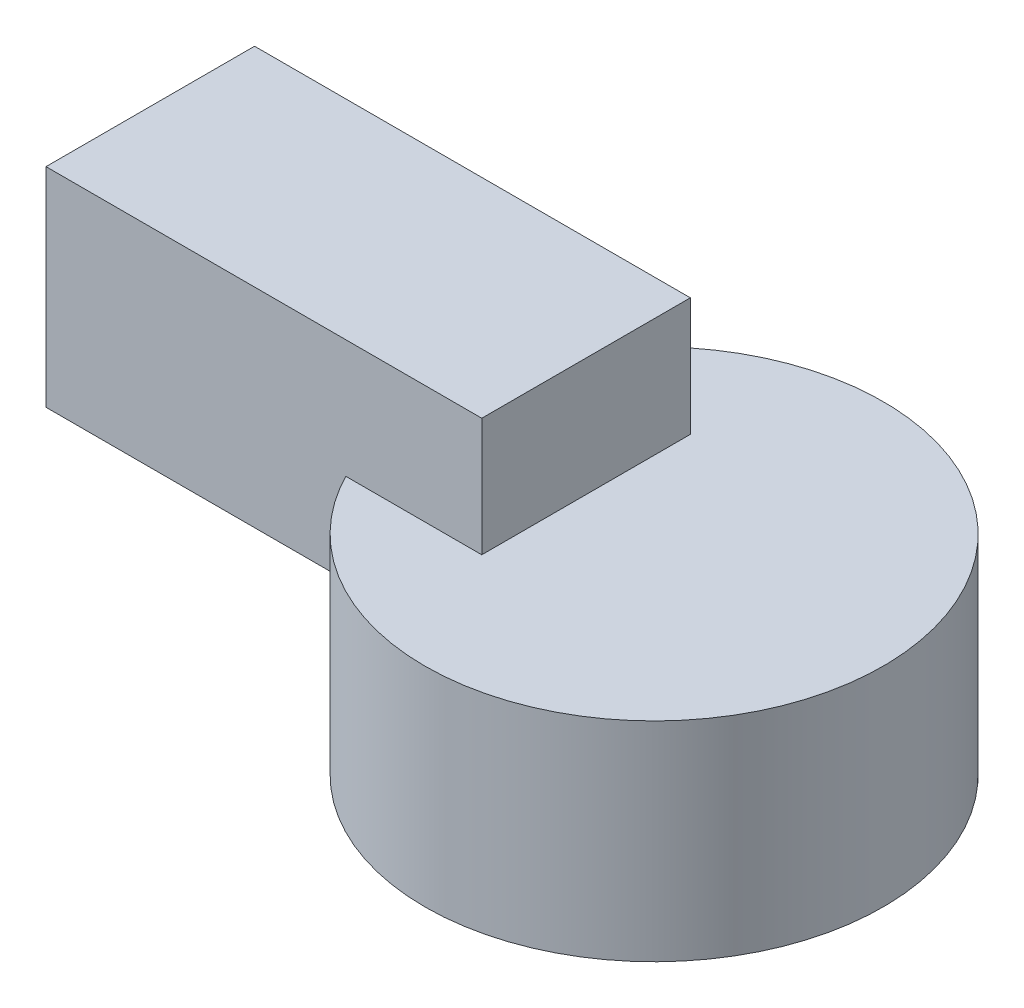
ISO-10303-21;
HEADER;
FILE_DESCRIPTION(('STEP AP214'),'2;1');
FILE_NAME('part.step','',(''),(''),'','','');
FILE_SCHEMA(('AUTOMOTIVE_DESIGN { 1 0 10303 214 1 1 1 1 }'));
ENDSEC;
DATA;
#1=APPLICATION_CONTEXT('core data for automotive mechanical design processes');
#2=APPLICATION_PROTOCOL_DEFINITION('international standard','automotive_design',2000,#1);
#3=PRODUCT_CONTEXT('',#1,'mechanical');
#4=PRODUCT('Part','Part','',(#3));
#5=PRODUCT_RELATED_PRODUCT_CATEGORY('part','',(#4));
#6=PRODUCT_DEFINITION_FORMATION('','',#4);
#7=PRODUCT_DEFINITION_CONTEXT('part definition',#1,'design');
#8=PRODUCT_DEFINITION('design','',#6,#7);
#9=PRODUCT_DEFINITION_SHAPE('','',#8);
#10=(LENGTH_UNIT() NAMED_UNIT(*) SI_UNIT(.MILLI.,.METRE.));
#11=(NAMED_UNIT(*) PLANE_ANGLE_UNIT() SI_UNIT($,.RADIAN.));
#12=(NAMED_UNIT(*) SI_UNIT($,.STERADIAN.) SOLID_ANGLE_UNIT());
#13=UNCERTAINTY_MEASURE_WITH_UNIT(LENGTH_MEASURE(1.E-05),#10,'distance_accuracy_value','');
#14=(GEOMETRIC_REPRESENTATION_CONTEXT(3) GLOBAL_UNCERTAINTY_ASSIGNED_CONTEXT((#13)) GLOBAL_UNIT_ASSIGNED_CONTEXT((#10,
#11,#12)) REPRESENTATION_CONTEXT('',''));
#15=CARTESIAN_POINT('',(0.,0.,0.));
#16=DIRECTION('',(0.,0.,1.));
#17=DIRECTION('',(1.,0.,0.));
#18=AXIS2_PLACEMENT_3D('',#15,#16,#17);
#19=CARTESIAN_POINT('',(-8.28668852170722,27.1040422059941,12.7));
#20=DIRECTION('',(-1.,0.,0.));
#21=DIRECTION('',(0.,0.,1.));
#22=AXIS2_PLACEMENT_3D('',#19,#20,#21);
#23=PLANE('',#22);
#24=DIRECTION('',(0.,1.,0.));
#25=VECTOR('',#24,1.);
#26=CARTESIAN_POINT('',(-8.28668852170722,27.1040422059941,-12.7));
#27=LINE('',#26,#25);
#28=CARTESIAN_POINT('',(-8.28668852170722,1.7217395924089,-12.7));
#29=VERTEX_POINT('',#28);
#30=CARTESIAN_POINT('',(-8.28668852170722,27.1040422059941,-12.7));
#31=VERTEX_POINT('',#30);
#32=EDGE_CURVE('E117',#29,#31,#27,.T.);
#33=ORIENTED_EDGE('',*,*,#32,.T.);
#34=DIRECTION('',(0.,0.,-1.));
#35=VECTOR('',#34,1.);
#36=CARTESIAN_POINT('',(-8.28668852170722,27.1040422059941,12.7));
#37=LINE('',#36,#35);
#38=CARTESIAN_POINT('',(-8.28668852170722,27.1040422059941,12.7));
#39=VERTEX_POINT('',#38);
#40=EDGE_CURVE('E12',#39,#31,#37,.T.);
#41=ORIENTED_EDGE('',*,*,#40,.F.);
#42=DIRECTION('',(0.,1.,0.));
#43=VECTOR('',#42,1.);
#44=CARTESIAN_POINT('',(-8.28668852170722,27.1040422059941,12.7));
#45=LINE('',#44,#43);
#46=CARTESIAN_POINT('',(-8.28668852170722,1.7217395924089,12.7));
#47=VERTEX_POINT('',#46);
#48=EDGE_CURVE('E99',#47,#39,#45,.T.);
#49=ORIENTED_EDGE('',*,*,#48,.F.);
#50=DIRECTION('',(0.,0.,-1.));
#51=VECTOR('',#50,1.);
#52=CARTESIAN_POINT('',(-8.28668852170722,1.7217395924089,12.7));
#53=LINE('',#52,#51);
#54=EDGE_CURVE('E113',#47,#29,#53,.T.);
#55=ORIENTED_EDGE('',*,*,#54,.T.);
#56=EDGE_LOOP('',(#33,#41,#49,#55));
#57=FACE_BOUND('',#56,.T.);
#58=ADVANCED_FACE('F47',(#57),#23,.F.);
#59=CARTESIAN_POINT('',(-61.3545877667383,27.1040422059941,12.7));
#60=DIRECTION('',(0.,-1.,0.));
#61=DIRECTION('',(0.,0.,-1.));
#62=AXIS2_PLACEMENT_3D('',#59,#60,#61);
#63=PLANE('',#62);
#64=DIRECTION('',(-1.,0.,0.));
#65=VECTOR('',#64,1.);
#66=CARTESIAN_POINT('',(-61.3545877667383,27.1040422059941,-12.7));
#67=LINE('',#66,#65);
#68=CARTESIAN_POINT('',(-61.3545877667383,27.1040422059941,-12.7));
#69=VERTEX_POINT('',#68);
#70=EDGE_CURVE('E104',#31,#69,#67,.T.);
#71=ORIENTED_EDGE('',*,*,#70,.T.);
#72=DIRECTION('',(0.,0.,-1.));
#73=VECTOR('',#72,1.);
#74=CARTESIAN_POINT('',(-61.3545877667383,27.1040422059941,12.7));
#75=LINE('',#74,#73);
#76=CARTESIAN_POINT('',(-61.3545877667383,27.1040422059941,12.7));
#77=VERTEX_POINT('',#76);
#78=EDGE_CURVE('E56',#77,#69,#75,.T.);
#79=ORIENTED_EDGE('',*,*,#78,.F.);
#80=DIRECTION('',(-1.,0.,0.));
#81=VECTOR('',#80,1.);
#82=CARTESIAN_POINT('',(-61.3545877667383,27.1040422059941,12.7));
#83=LINE('',#82,#81);
#84=EDGE_CURVE('E94',#39,#77,#83,.T.);
#85=ORIENTED_EDGE('',*,*,#84,.F.);
#86=ORIENTED_EDGE('',*,*,#40,.T.);
#87=EDGE_LOOP('',(#71,#79,#85,#86));
#88=FACE_BOUND('',#87,.T.);
#89=ADVANCED_FACE('F103',(#88),#63,.F.);
#90=CARTESIAN_POINT('',(-61.3545877667383,27.1040422059941,12.7));
#91=DIRECTION('',(1.,0.,0.));
#92=DIRECTION('',(0.,1.,0.));
#93=AXIS2_PLACEMENT_3D('',#90,#91,#92);
#94=PLANE('',#93);
#95=DIRECTION('',(0.,-1.,0.));
#96=VECTOR('',#95,1.);
#97=CARTESIAN_POINT('',(-61.3545877667383,27.1040422059941,-12.7));
#98=LINE('',#97,#96);
#99=CARTESIAN_POINT('',(-61.3545877667383,1.7217395924089,-12.7));
#100=VERTEX_POINT('',#99);
#101=EDGE_CURVE('E81',#69,#100,#98,.T.);
#102=ORIENTED_EDGE('',*,*,#101,.T.);
#103=DIRECTION('',(0.,0.,-1.));
#104=VECTOR('',#103,1.);
#105=CARTESIAN_POINT('',(-61.3545877667383,1.7217395924089,12.7));
#106=LINE('',#105,#104);
#107=CARTESIAN_POINT('',(-61.3545877667383,1.7217395924089,12.7));
#108=VERTEX_POINT('',#107);
#109=EDGE_CURVE('E106',#108,#100,#106,.T.);
#110=ORIENTED_EDGE('',*,*,#109,.F.);
#111=DIRECTION('',(0.,-1.,0.));
#112=VECTOR('',#111,1.);
#113=CARTESIAN_POINT('',(-61.3545877667383,27.1040422059941,12.7));
#114=LINE('',#113,#112);
#115=EDGE_CURVE('E97',#77,#108,#114,.T.);
#116=ORIENTED_EDGE('',*,*,#115,.F.);
#117=ORIENTED_EDGE('',*,*,#78,.T.);
#118=EDGE_LOOP('',(#102,#110,#116,#117));
#119=FACE_BOUND('',#118,.T.);
#120=ADVANCED_FACE('F107',(#119),#94,.F.);
#121=CARTESIAN_POINT('',(-61.3545877667383,1.7217395924089,12.7));
#122=DIRECTION('',(0.,1.,0.));
#123=DIRECTION('',(0.,0.,1.));
#124=AXIS2_PLACEMENT_3D('',#121,#122,#123);
#125=PLANE('',#124);
#126=DIRECTION('',(1.,0.,0.));
#127=VECTOR('',#126,1.);
#128=CARTESIAN_POINT('',(-61.3545877667383,1.7217395924089,-12.7));
#129=LINE('',#128,#127);
#130=EDGE_CURVE('E87',#100,#29,#129,.T.);
#131=ORIENTED_EDGE('',*,*,#130,.T.);
#132=ORIENTED_EDGE('',*,*,#54,.F.);
#133=DIRECTION('',(1.,0.,0.));
#134=VECTOR('',#133,1.);
#135=CARTESIAN_POINT('',(-61.3545877667383,1.7217395924089,12.7));
#136=LINE('',#135,#134);
#137=EDGE_CURVE('E64',#108,#47,#136,.T.);
#138=ORIENTED_EDGE('',*,*,#137,.F.);
#139=ORIENTED_EDGE('',*,*,#109,.T.);
#140=EDGE_LOOP('',(#131,#132,#138,#139));
#141=FACE_BOUND('',#140,.T.);
#142=ADVANCED_FACE('F128',(#141),#125,.F.);
#143=CARTESIAN_POINT('',(0.,0.,12.7));
#144=DIRECTION('',(0.,0.,1.));
#145=DIRECTION('',(1.,0.,0.));
#146=AXIS2_PLACEMENT_3D('',#143,#144,#145);
#147=PLANE('',#146);
#148=ORIENTED_EDGE('',*,*,#48,.T.);
#149=ORIENTED_EDGE('',*,*,#84,.T.);
#150=ORIENTED_EDGE('',*,*,#115,.T.);
#151=ORIENTED_EDGE('',*,*,#137,.T.);
#152=EDGE_LOOP('',(#148,#149,#150,#151));
#153=FACE_BOUND('',#152,.T.);
#154=ADVANCED_FACE('F95',(#153),#147,.T.);
#155=CARTESIAN_POINT('',(0.,0.,-12.7));
#156=DIRECTION('',(0.,0.,1.));
#157=DIRECTION('',(1.,0.,0.));
#158=AXIS2_PLACEMENT_3D('',#155,#156,#157);
#159=PLANE('',#158);
#160=ORIENTED_EDGE('',*,*,#32,.F.);
#161=ORIENTED_EDGE('',*,*,#130,.F.);
#162=ORIENTED_EDGE('',*,*,#101,.F.);
#163=ORIENTED_EDGE('',*,*,#70,.F.);
#164=EDGE_LOOP('',(#160,#161,#162,#163));
#165=FACE_BOUND('',#164,.T.);
#166=ADVANCED_FACE('F131',(#165),#159,.F.);
#167=CLOSED_SHELL('',(#58,#89,#120,#142,#154,#166));
#168=MANIFOLD_SOLID_BREP('B2_NOT_SHOWN',#167);
#169=CARTESIAN_POINT('',(0.,12.7,0.));
#170=DIRECTION('',(0.,-1.,0.));
#171=DIRECTION('',(0.,0.,-1.));
#172=AXIS2_PLACEMENT_3D('',#169,#170,#171);
#173=CYLINDRICAL_SURFACE('',#172,27.9038921304852);
#174=CARTESIAN_POINT('',(0.,12.7,0.));
#175=DIRECTION('',(0.,1.,0.));
#176=DIRECTION('',(0.,0.,1.));
#177=AXIS2_PLACEMENT_3D('',#174,#175,#176);
#178=CIRCLE('',#177,27.9038921304852);
#179=CARTESIAN_POINT('',(0.,12.7,27.9038921304852));
#180=VERTEX_POINT('',#179);
#181=EDGE_CURVE('E46',#180,#180,#178,.T.);
#182=ORIENTED_EDGE('',*,*,#181,.F.);
#183=EDGE_LOOP('',(#182));
#184=FACE_BOUND('',#183,.T.);
#185=CARTESIAN_POINT('',(0.,-12.7,0.));
#186=DIRECTION('',(0.,1.,0.));
#187=DIRECTION('',(0.,0.,1.));
#188=AXIS2_PLACEMENT_3D('',#185,#186,#187);
#189=CIRCLE('',#188,27.9038921304852);
#190=CARTESIAN_POINT('',(0.,-12.7,27.9038921304852));
#191=VERTEX_POINT('',#190);
#192=EDGE_CURVE('E191',#191,#191,#189,.T.);
#193=ORIENTED_EDGE('',*,*,#192,.T.);
#194=EDGE_LOOP('',(#193));
#195=FACE_BOUND('',#194,.T.);
#196=ADVANCED_FACE('F188',(#184,#195),#173,.T.);
#197=CARTESIAN_POINT('',(0.,12.7,0.));
#198=DIRECTION('',(0.,1.,0.));
#199=DIRECTION('',(0.,0.,1.));
#200=AXIS2_PLACEMENT_3D('',#197,#198,#199);
#201=PLANE('',#200);
#202=ORIENTED_EDGE('',*,*,#181,.T.);
#203=EDGE_LOOP('',(#202));
#204=FACE_BOUND('',#203,.T.);
#205=ADVANCED_FACE('F205',(#204),#201,.T.);
#206=CARTESIAN_POINT('',(0.,-12.7,0.));
#207=DIRECTION('',(0.,1.,0.));
#208=DIRECTION('',(0.,0.,1.));
#209=AXIS2_PLACEMENT_3D('',#206,#207,#208);
#210=PLANE('',#209);
#211=ORIENTED_EDGE('',*,*,#192,.F.);
#212=EDGE_LOOP('',(#211));
#213=FACE_BOUND('',#212,.T.);
#214=ADVANCED_FACE('F203',(#213),#210,.F.);
#215=CLOSED_SHELL('',(#196,#205,#214));
#216=MANIFOLD_SOLID_BREP('B6',#215);
#217=ADVANCED_BREP_SHAPE_REPRESENTATION('',(#18,#168,#216),#14);
#218=SHAPE_DEFINITION_REPRESENTATION(#9,#217);
ENDSEC;
END-ISO-10303-21;
